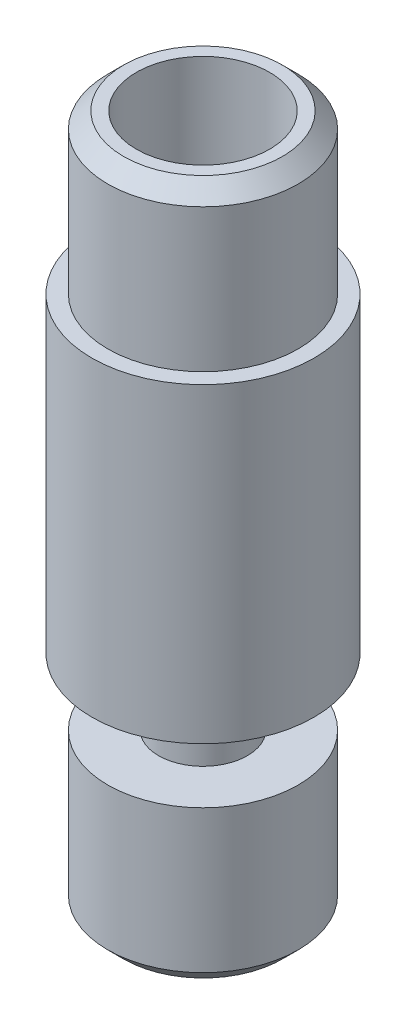
ISO-10303-21;
HEADER;
FILE_DESCRIPTION(('STEP AP214'),'2;1');
FILE_NAME('part.step','',(''),(''),'','','');
FILE_SCHEMA(('AUTOMOTIVE_DESIGN { 1 0 10303 214 1 1 1 1 }'));
ENDSEC;
DATA;
#1=APPLICATION_CONTEXT('core data for automotive mechanical design processes');
#2=APPLICATION_PROTOCOL_DEFINITION('international standard','automotive_design',2000,#1);
#3=PRODUCT_CONTEXT('',#1,'mechanical');
#4=PRODUCT('Part','Part','',(#3));
#5=PRODUCT_RELATED_PRODUCT_CATEGORY('part','',(#4));
#6=PRODUCT_DEFINITION_FORMATION('','',#4);
#7=PRODUCT_DEFINITION_CONTEXT('part definition',#1,'design');
#8=PRODUCT_DEFINITION('design','',#6,#7);
#9=PRODUCT_DEFINITION_SHAPE('','',#8);
#10=(LENGTH_UNIT() NAMED_UNIT(*) SI_UNIT(.MILLI.,.METRE.));
#11=(NAMED_UNIT(*) PLANE_ANGLE_UNIT() SI_UNIT($,.RADIAN.));
#12=(NAMED_UNIT(*) SI_UNIT($,.STERADIAN.) SOLID_ANGLE_UNIT());
#13=UNCERTAINTY_MEASURE_WITH_UNIT(LENGTH_MEASURE(1.E-05),#10,'distance_accuracy_value','');
#14=(GEOMETRIC_REPRESENTATION_CONTEXT(3) GLOBAL_UNCERTAINTY_ASSIGNED_CONTEXT((#13)) GLOBAL_UNIT_ASSIGNED_CONTEXT((#10,
#11,#12)) REPRESENTATION_CONTEXT('',''));
#15=CARTESIAN_POINT('',(0.,0.,0.));
#16=DIRECTION('',(0.,0.,1.));
#17=DIRECTION('',(1.,0.,0.));
#18=AXIS2_PLACEMENT_3D('',#15,#16,#17);
#19=CARTESIAN_POINT('',(0.,0.499999999999998,0.));
#20=DIRECTION('',(0.,1.,0.));
#21=DIRECTION('',(0.,0.,1.));
#22=AXIS2_PLACEMENT_3D('',#19,#20,#21);
#23=CONICAL_SURFACE('',#22,3.,0.78539816339745);
#24=CARTESIAN_POINT('',(0.,2.72844996841357E-11,0.));
#25=DIRECTION('',(0.,1.,0.));
#26=DIRECTION('',(0.,0.,1.));
#27=AXIS2_PLACEMENT_3D('',#24,#25,#26);
#28=CIRCLE('',#27,2.50000000002728);
#29=CARTESIAN_POINT('',(0.,2.72844996841357E-11,2.50000000002728));
#30=VERTEX_POINT('',#29);
#31=EDGE_CURVE('E78',#30,#30,#28,.T.);
#32=ORIENTED_EDGE('',*,*,#31,.T.);
#33=EDGE_LOOP('',(#32));
#34=FACE_BOUND('',#33,.T.);
#35=CARTESIAN_POINT('',(0.,0.499999999999998,0.));
#36=DIRECTION('',(0.,1.,0.));
#37=DIRECTION('',(0.,0.,1.));
#38=AXIS2_PLACEMENT_3D('',#35,#36,#37);
#39=CIRCLE('',#38,3.);
#40=CARTESIAN_POINT('',(0.,0.499999999999998,3.));
#41=VERTEX_POINT('',#40);
#42=EDGE_CURVE('E10',#41,#41,#39,.T.);
#43=ORIENTED_EDGE('',*,*,#42,.F.);
#44=EDGE_LOOP('',(#43));
#45=FACE_BOUND('',#44,.T.);
#46=ADVANCED_FACE('F32',(#34,#45),#23,.T.);
#47=CARTESIAN_POINT('',(0.,0.,0.));
#48=DIRECTION('',(0.,1.,0.));
#49=DIRECTION('',(0.,0.,1.));
#50=AXIS2_PLACEMENT_3D('',#47,#48,#49);
#51=CYLINDRICAL_SURFACE('',#50,3.);
#52=ORIENTED_EDGE('',*,*,#42,.T.);
#53=EDGE_LOOP('',(#52));
#54=FACE_BOUND('',#53,.T.);
#55=CARTESIAN_POINT('',(0.,5.,0.));
#56=DIRECTION('',(0.,1.,0.));
#57=DIRECTION('',(0.,0.,1.));
#58=AXIS2_PLACEMENT_3D('',#55,#56,#57);
#59=CIRCLE('',#58,3.);
#60=CARTESIAN_POINT('',(0.,5.,3.));
#61=VERTEX_POINT('',#60);
#62=EDGE_CURVE('E38',#61,#61,#59,.T.);
#63=ORIENTED_EDGE('',*,*,#62,.F.);
#64=EDGE_LOOP('',(#63));
#65=FACE_BOUND('',#64,.T.);
#66=ADVANCED_FACE('F96',(#54,#65),#51,.T.);
#67=CARTESIAN_POINT('',(1.4,5.,0.));
#68=DIRECTION('',(0.,1.,0.));
#69=DIRECTION('',(0.,0.,1.));
#70=AXIS2_PLACEMENT_3D('',#67,#68,#69);
#71=PLANE('',#70);
#72=ORIENTED_EDGE('',*,*,#62,.T.);
#73=EDGE_LOOP('',(#72));
#74=FACE_BOUND('',#73,.T.);
#75=CARTESIAN_POINT('',(0.,5.,0.));
#76=DIRECTION('',(0.,1.,0.));
#77=DIRECTION('',(0.,0.,1.));
#78=AXIS2_PLACEMENT_3D('',#75,#76,#77);
#79=CIRCLE('',#78,1.4);
#80=CARTESIAN_POINT('',(0.,5.,1.4));
#81=VERTEX_POINT('',#80);
#82=EDGE_CURVE('E42',#81,#81,#79,.T.);
#83=ORIENTED_EDGE('',*,*,#82,.F.);
#84=EDGE_LOOP('',(#83));
#85=FACE_BOUND('',#84,.T.);
#86=ADVANCED_FACE('F100',(#74,#85),#71,.T.);
#87=CARTESIAN_POINT('',(0.,0.,0.));
#88=DIRECTION('',(0.,1.,0.));
#89=DIRECTION('',(0.,0.,1.));
#90=AXIS2_PLACEMENT_3D('',#87,#88,#89);
#91=CYLINDRICAL_SURFACE('',#90,1.4);
#92=ORIENTED_EDGE('',*,*,#82,.T.);
#93=EDGE_LOOP('',(#92));
#94=FACE_BOUND('',#93,.T.);
#95=CARTESIAN_POINT('',(0.,7.1,0.));
#96=DIRECTION('',(0.,1.,0.));
#97=DIRECTION('',(0.,0.,1.));
#98=AXIS2_PLACEMENT_3D('',#95,#96,#97);
#99=CIRCLE('',#98,1.4);
#100=CARTESIAN_POINT('',(0.,7.1,1.4));
#101=VERTEX_POINT('',#100);
#102=EDGE_CURVE('E46',#101,#101,#99,.T.);
#103=ORIENTED_EDGE('',*,*,#102,.F.);
#104=EDGE_LOOP('',(#103));
#105=FACE_BOUND('',#104,.T.);
#106=ADVANCED_FACE('F104',(#94,#105),#91,.T.);
#107=CARTESIAN_POINT('',(3.5,7.1,0.));
#108=DIRECTION('',(0.,-1.,0.));
#109=DIRECTION('',(0.,0.,-1.));
#110=AXIS2_PLACEMENT_3D('',#107,#108,#109);
#111=PLANE('',#110);
#112=ORIENTED_EDGE('',*,*,#102,.T.);
#113=EDGE_LOOP('',(#112));
#114=FACE_BOUND('',#113,.T.);
#115=CARTESIAN_POINT('',(0.,7.1,0.));
#116=DIRECTION('',(0.,1.,0.));
#117=DIRECTION('',(0.,0.,1.));
#118=AXIS2_PLACEMENT_3D('',#115,#116,#117);
#119=CIRCLE('',#118,3.5);
#120=CARTESIAN_POINT('',(0.,7.1,3.5));
#121=VERTEX_POINT('',#120);
#122=EDGE_CURVE('E51',#121,#121,#119,.T.);
#123=ORIENTED_EDGE('',*,*,#122,.F.);
#124=EDGE_LOOP('',(#123));
#125=FACE_BOUND('',#124,.T.);
#126=ADVANCED_FACE('F110',(#114,#125),#111,.T.);
#127=CARTESIAN_POINT('',(0.,0.,0.));
#128=DIRECTION('',(0.,1.,0.));
#129=DIRECTION('',(0.,0.,1.));
#130=AXIS2_PLACEMENT_3D('',#127,#128,#129);
#131=CYLINDRICAL_SURFACE('',#130,3.5);
#132=ORIENTED_EDGE('',*,*,#122,.T.);
#133=EDGE_LOOP('',(#132));
#134=FACE_BOUND('',#133,.T.);
#135=CARTESIAN_POINT('',(0.,16.9,0.));
#136=DIRECTION('',(0.,1.,0.));
#137=DIRECTION('',(0.,0.,1.));
#138=AXIS2_PLACEMENT_3D('',#135,#136,#137);
#139=CIRCLE('',#138,3.5);
#140=CARTESIAN_POINT('',(0.,16.9,3.5));
#141=VERTEX_POINT('',#140);
#142=EDGE_CURVE('E54',#141,#141,#139,.T.);
#143=ORIENTED_EDGE('',*,*,#142,.F.);
#144=EDGE_LOOP('',(#143));
#145=FACE_BOUND('',#144,.T.);
#146=ADVANCED_FACE('F114',(#134,#145),#131,.T.);
#147=CARTESIAN_POINT('',(3.,16.9,0.));
#148=DIRECTION('',(0.,1.,0.));
#149=DIRECTION('',(0.,0.,1.));
#150=AXIS2_PLACEMENT_3D('',#147,#148,#149);
#151=PLANE('',#150);
#152=ORIENTED_EDGE('',*,*,#142,.T.);
#153=EDGE_LOOP('',(#152));
#154=FACE_BOUND('',#153,.T.);
#155=CARTESIAN_POINT('',(0.,16.9,0.));
#156=DIRECTION('',(0.,1.,0.));
#157=DIRECTION('',(0.,0.,1.));
#158=AXIS2_PLACEMENT_3D('',#155,#156,#157);
#159=CIRCLE('',#158,3.);
#160=CARTESIAN_POINT('',(0.,16.9,3.));
#161=VERTEX_POINT('',#160);
#162=EDGE_CURVE('E57',#161,#161,#159,.T.);
#163=ORIENTED_EDGE('',*,*,#162,.F.);
#164=EDGE_LOOP('',(#163));
#165=FACE_BOUND('',#164,.T.);
#166=ADVANCED_FACE('F118',(#154,#165),#151,.T.);
#167=CARTESIAN_POINT('',(0.,0.,0.));
#168=DIRECTION('',(0.,1.,0.));
#169=DIRECTION('',(0.,0.,1.));
#170=AXIS2_PLACEMENT_3D('',#167,#168,#169);
#171=CYLINDRICAL_SURFACE('',#170,3.);
#172=ORIENTED_EDGE('',*,*,#162,.T.);
#173=EDGE_LOOP('',(#172));
#174=FACE_BOUND('',#173,.T.);
#175=CARTESIAN_POINT('',(0.,21.4,0.));
#176=DIRECTION('',(0.,1.,0.));
#177=DIRECTION('',(0.,0.,1.));
#178=AXIS2_PLACEMENT_3D('',#175,#176,#177);
#179=CIRCLE('',#178,3.);
#180=CARTESIAN_POINT('',(0.,21.4,3.));
#181=VERTEX_POINT('',#180);
#182=EDGE_CURVE('E60',#181,#181,#179,.T.);
#183=ORIENTED_EDGE('',*,*,#182,.F.);
#184=EDGE_LOOP('',(#183));
#185=FACE_BOUND('',#184,.T.);
#186=ADVANCED_FACE('F122',(#174,#185),#171,.T.);
#187=CARTESIAN_POINT('',(0.,21.8999999999809,0.));
#188=DIRECTION('',(0.,-1.,0.));
#189=DIRECTION('',(0.,0.,-1.));
#190=AXIS2_PLACEMENT_3D('',#187,#188,#189);
#191=CONICAL_SURFACE('',#190,2.50000000001905,0.78539816339745);
#192=ORIENTED_EDGE('',*,*,#182,.T.);
#193=EDGE_LOOP('',(#192));
#194=FACE_BOUND('',#193,.T.);
#195=CARTESIAN_POINT('',(0.,21.8999999999809,0.));
#196=DIRECTION('',(0.,1.,0.));
#197=DIRECTION('',(0.,0.,1.));
#198=AXIS2_PLACEMENT_3D('',#195,#196,#197);
#199=CIRCLE('',#198,2.50000000001905);
#200=CARTESIAN_POINT('',(0.,21.8999999999809,2.50000000001905));
#201=VERTEX_POINT('',#200);
#202=EDGE_CURVE('E63',#201,#201,#199,.T.);
#203=ORIENTED_EDGE('',*,*,#202,.F.);
#204=EDGE_LOOP('',(#203));
#205=FACE_BOUND('',#204,.T.);
#206=ADVANCED_FACE('F126',(#194,#205),#191,.T.);
#207=CARTESIAN_POINT('',(2.10000000002133,21.8999999999809,0.));
#208=DIRECTION('',(0.,1.,0.));
#209=DIRECTION('',(0.,0.,1.));
#210=AXIS2_PLACEMENT_3D('',#207,#208,#209);
#211=PLANE('',#210);
#212=ORIENTED_EDGE('',*,*,#202,.T.);
#213=EDGE_LOOP('',(#212));
#214=FACE_BOUND('',#213,.T.);
#215=CARTESIAN_POINT('',(0.,21.8999999999809,0.));
#216=DIRECTION('',(0.,1.,0.));
#217=DIRECTION('',(0.,0.,1.));
#218=AXIS2_PLACEMENT_3D('',#215,#216,#217);
#219=CIRCLE('',#218,2.10000000002133);
#220=CARTESIAN_POINT('',(0.,21.8999999999809,2.10000000002133));
#221=VERTEX_POINT('',#220);
#222=EDGE_CURVE('E66',#221,#221,#219,.T.);
#223=ORIENTED_EDGE('',*,*,#222,.F.);
#224=EDGE_LOOP('',(#223));
#225=FACE_BOUND('',#224,.T.);
#226=ADVANCED_FACE('F130',(#214,#225),#211,.T.);
#227=CARTESIAN_POINT('',(0.,0.,0.));
#228=DIRECTION('',(0.,1.,0.));
#229=DIRECTION('',(0.,0.,1.));
#230=AXIS2_PLACEMENT_3D('',#227,#228,#229);
#231=CYLINDRICAL_SURFACE('',#230,2.10000000002133);
#232=ORIENTED_EDGE('',*,*,#222,.T.);
#233=EDGE_LOOP('',(#232));
#234=FACE_BOUND('',#233,.T.);
#235=CARTESIAN_POINT('',(0.,16.8999999999809,0.));
#236=DIRECTION('',(0.,1.,0.));
#237=DIRECTION('',(0.,0.,1.));
#238=AXIS2_PLACEMENT_3D('',#235,#236,#237);
#239=CIRCLE('',#238,2.10000000002133);
#240=CARTESIAN_POINT('',(0.,16.8999999999809,2.10000000002133));
#241=VERTEX_POINT('',#240);
#242=EDGE_CURVE('E69',#241,#241,#239,.T.);
#243=ORIENTED_EDGE('',*,*,#242,.F.);
#244=EDGE_LOOP('',(#243));
#245=FACE_BOUND('',#244,.T.);
#246=ADVANCED_FACE('F134',(#234,#245),#231,.F.);
#247=CARTESIAN_POINT('',(0.,15.7999999999472,0.));
#248=DIRECTION('',(0.,1.,0.));
#249=DIRECTION('',(0.,0.,1.));
#250=AXIS2_PLACEMENT_3D('',#247,#248,#249);
#251=CONICAL_SURFACE('',#250,0.999999999987541,0.785398163397448);
#252=ORIENTED_EDGE('',*,*,#242,.T.);
#253=EDGE_LOOP('',(#252));
#254=FACE_BOUND('',#253,.T.);
#255=CARTESIAN_POINT('',(0.,15.7999999999472,0.));
#256=DIRECTION('',(0.,1.,0.));
#257=DIRECTION('',(0.,0.,1.));
#258=AXIS2_PLACEMENT_3D('',#255,#256,#257);
#259=CIRCLE('',#258,0.999999999987541);
#260=CARTESIAN_POINT('',(0.,15.7999999999472,0.999999999987541));
#261=VERTEX_POINT('',#260);
#262=EDGE_CURVE('E72',#261,#261,#259,.T.);
#263=ORIENTED_EDGE('',*,*,#262,.F.);
#264=EDGE_LOOP('',(#263));
#265=FACE_BOUND('',#264,.T.);
#266=ADVANCED_FACE('F92',(#254,#265),#251,.F.);
#267=CARTESIAN_POINT('',(0.,0.,0.));
#268=DIRECTION('',(0.,1.,0.));
#269=DIRECTION('',(0.,0.,1.));
#270=AXIS2_PLACEMENT_3D('',#267,#268,#269);
#271=CYLINDRICAL_SURFACE('',#270,0.999999999987541);
#272=ORIENTED_EDGE('',*,*,#262,.T.);
#273=EDGE_LOOP('',(#272));
#274=FACE_BOUND('',#273,.T.);
#275=CARTESIAN_POINT('',(0.,2.72844996841357E-11,0.));
#276=DIRECTION('',(0.,1.,0.));
#277=DIRECTION('',(0.,0.,1.));
#278=AXIS2_PLACEMENT_3D('',#275,#276,#277);
#279=CIRCLE('',#278,0.999999999987541);
#280=CARTESIAN_POINT('',(0.,2.72844996841357E-11,0.999999999987541));
#281=VERTEX_POINT('',#280);
#282=EDGE_CURVE('E75',#281,#281,#279,.T.);
#283=ORIENTED_EDGE('',*,*,#282,.F.);
#284=EDGE_LOOP('',(#283));
#285=FACE_BOUND('',#284,.T.);
#286=ADVANCED_FACE('F86',(#274,#285),#271,.F.);
#287=CARTESIAN_POINT('',(2.50000000002728,2.72844996841357E-11,0.));
#288=DIRECTION('',(0.,-1.,0.));
#289=DIRECTION('',(0.,0.,-1.));
#290=AXIS2_PLACEMENT_3D('',#287,#288,#289);
#291=PLANE('',#290);
#292=ORIENTED_EDGE('',*,*,#282,.T.);
#293=EDGE_LOOP('',(#292));
#294=FACE_BOUND('',#293,.T.);
#295=ORIENTED_EDGE('',*,*,#31,.F.);
#296=EDGE_LOOP('',(#295));
#297=FACE_BOUND('',#296,.T.);
#298=ADVANCED_FACE('F84',(#294,#297),#291,.T.);
#299=CLOSED_SHELL('',(#46,#66,#86,#106,#126,#146,#166,#186,#206,#226,#246,#266,#286,#298));
#300=MANIFOLD_SOLID_BREP('B2',#299);
#301=ADVANCED_BREP_SHAPE_REPRESENTATION('',(#18,#300),#14);
#302=SHAPE_DEFINITION_REPRESENTATION(#9,#301);
ENDSEC;
END-ISO-10303-21;
